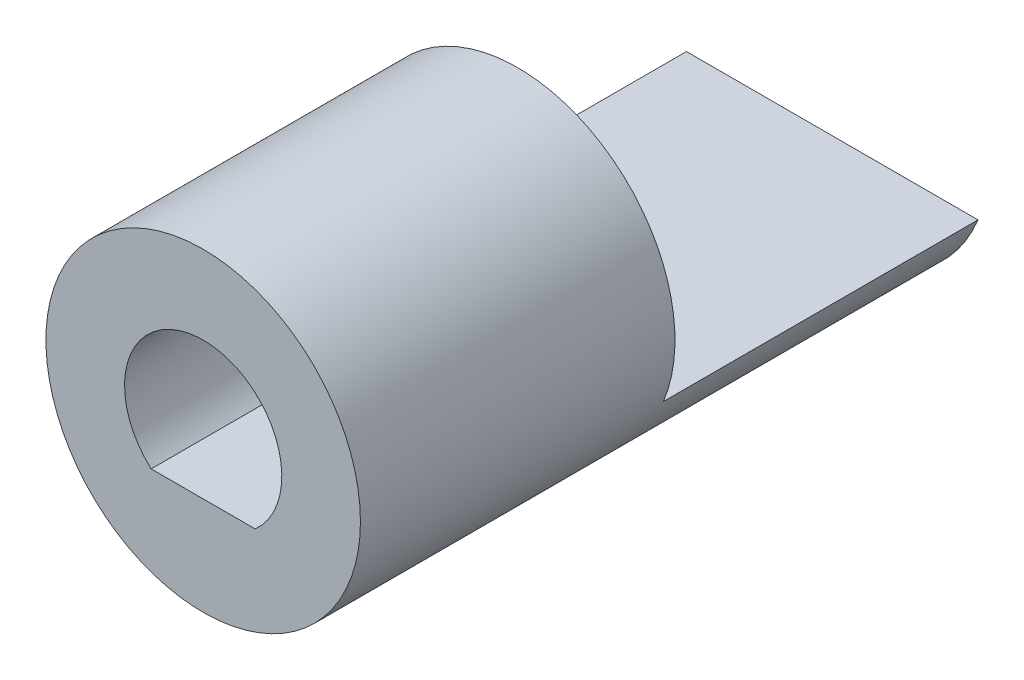
ISO-10303-21;
HEADER;
FILE_DESCRIPTION(('STEP AP214'),'2;1');
FILE_NAME('part.step','',(''),(''),'','','');
FILE_SCHEMA(('AUTOMOTIVE_DESIGN { 1 0 10303 214 1 1 1 1 }'));
ENDSEC;
DATA;
#1=APPLICATION_CONTEXT('core data for automotive mechanical design processes');
#2=APPLICATION_PROTOCOL_DEFINITION('international standard','automotive_design',2000,#1);
#3=PRODUCT_CONTEXT('',#1,'mechanical');
#4=PRODUCT('Part','Part','',(#3));
#5=PRODUCT_RELATED_PRODUCT_CATEGORY('part','',(#4));
#6=PRODUCT_DEFINITION_FORMATION('','',#4);
#7=PRODUCT_DEFINITION_CONTEXT('part definition',#1,'design');
#8=PRODUCT_DEFINITION('design','',#6,#7);
#9=PRODUCT_DEFINITION_SHAPE('','',#8);
#10=(LENGTH_UNIT() NAMED_UNIT(*) SI_UNIT(.MILLI.,.METRE.));
#11=(NAMED_UNIT(*) PLANE_ANGLE_UNIT() SI_UNIT($,.RADIAN.));
#12=(NAMED_UNIT(*) SI_UNIT($,.STERADIAN.) SOLID_ANGLE_UNIT());
#13=UNCERTAINTY_MEASURE_WITH_UNIT(LENGTH_MEASURE(1.E-05),#10,'distance_accuracy_value','');
#14=(GEOMETRIC_REPRESENTATION_CONTEXT(3) GLOBAL_UNCERTAINTY_ASSIGNED_CONTEXT((#13)) GLOBAL_UNIT_ASSIGNED_CONTEXT((#10,
#11,#12)) REPRESENTATION_CONTEXT('',''));
#15=CARTESIAN_POINT('',(0.,0.,0.));
#16=DIRECTION('',(0.,0.,1.));
#17=DIRECTION('',(1.,0.,0.));
#18=AXIS2_PLACEMENT_3D('',#15,#16,#17);
#19=CARTESIAN_POINT('',(0.,0.,0.));
#20=DIRECTION('',(0.,0.,1.));
#21=DIRECTION('',(1.,0.,0.));
#22=AXIS2_PLACEMENT_3D('',#19,#20,#21);
#23=PLANE('',#22);
#24=DIRECTION('',(1.,0.,0.));
#25=VECTOR('',#24,1.);
#26=CARTESIAN_POINT('',(0.,-4.7625,0.));
#27=LINE('',#26,#25);
#28=CARTESIAN_POINT('',(-11.7732150982644,-4.7625,0.));
#29=VERTEX_POINT('',#28);
#30=CARTESIAN_POINT('',(-4.20013020631504,-4.7625,0.));
#31=VERTEX_POINT('',#30);
#32=EDGE_CURVE('E50',#29,#31,#27,.T.);
#33=ORIENTED_EDGE('',*,*,#32,.F.);
#34=CARTESIAN_POINT('',(0.,0.,0.));
#35=DIRECTION('',(0.,0.,1.));
#36=DIRECTION('',(1.,0.,0.));
#37=AXIS2_PLACEMENT_3D('',#34,#35,#36);
#38=CIRCLE('',#37,12.7);
#39=CARTESIAN_POINT('',(11.7732150982644,-4.7625,0.));
#40=VERTEX_POINT('',#39);
#41=EDGE_CURVE('E78',#40,#29,#38,.T.);
#42=ORIENTED_EDGE('',*,*,#41,.F.);
#43=CARTESIAN_POINT('',(4.20013020631504,-4.7625,0.));
#44=VERTEX_POINT('',#43);
#45=EDGE_CURVE('E11',#44,#40,#27,.T.);
#46=ORIENTED_EDGE('',*,*,#45,.F.);
#47=CARTESIAN_POINT('',(0.,0.,0.));
#48=DIRECTION('',(0.,0.,1.));
#49=DIRECTION('',(1.,0.,0.));
#50=AXIS2_PLACEMENT_3D('',#47,#48,#49);
#51=CIRCLE('',#50,6.35);
#52=EDGE_CURVE('E76',#44,#31,#51,.T.);
#53=ORIENTED_EDGE('',*,*,#52,.T.);
#54=EDGE_LOOP('',(#33,#42,#46,#53));
#55=FACE_BOUND('',#54,.T.);
#56=ADVANCED_FACE('F39',(#55),#23,.F.);
#57=CARTESIAN_POINT('',(0.,-4.7625,25.4));
#58=DIRECTION('',(0.,1.,0.));
#59=DIRECTION('',(0.,0.,1.));
#60=AXIS2_PLACEMENT_3D('',#57,#58,#59);
#61=PLANE('',#60);
#62=DIRECTION('',(0.,0.,-1.));
#63=VECTOR('',#62,1.);
#64=CARTESIAN_POINT('',(4.20013020631504,-4.7625,25.4));
#65=LINE('',#64,#63);
#66=CARTESIAN_POINT('',(4.20013020631504,-4.7625,25.4));
#67=VERTEX_POINT('',#66);
#68=EDGE_CURVE('E65',#67,#44,#65,.T.);
#69=ORIENTED_EDGE('',*,*,#68,.T.);
#70=ORIENTED_EDGE('',*,*,#45,.T.);
#71=DIRECTION('',(0.,0.,1.));
#72=VECTOR('',#71,1.);
#73=CARTESIAN_POINT('',(11.7732150982644,-4.7625,-25.4));
#74=LINE('',#73,#72);
#75=CARTESIAN_POINT('',(11.7732150982644,-4.7625,-25.4));
#76=VERTEX_POINT('',#75);
#77=EDGE_CURVE('E89',#76,#40,#74,.T.);
#78=ORIENTED_EDGE('',*,*,#77,.F.);
#79=DIRECTION('',(1.,0.,0.));
#80=VECTOR('',#79,1.);
#81=CARTESIAN_POINT('',(0.,-4.7625,-25.4));
#82=LINE('',#81,#80);
#83=CARTESIAN_POINT('',(-11.7732150982644,-4.7625,-25.4));
#84=VERTEX_POINT('',#83);
#85=EDGE_CURVE('E110',#84,#76,#82,.T.);
#86=ORIENTED_EDGE('',*,*,#85,.F.);
#87=DIRECTION('',(0.,0.,1.));
#88=VECTOR('',#87,1.);
#89=CARTESIAN_POINT('',(-11.7732150982644,-4.7625,-25.4));
#90=LINE('',#89,#88);
#91=EDGE_CURVE('E94',#84,#29,#90,.T.);
#92=ORIENTED_EDGE('',*,*,#91,.T.);
#93=ORIENTED_EDGE('',*,*,#32,.T.);
#94=DIRECTION('',(0.,0.,-1.));
#95=VECTOR('',#94,1.);
#96=CARTESIAN_POINT('',(-4.20013020631504,-4.7625,25.4));
#97=LINE('',#96,#95);
#98=CARTESIAN_POINT('',(-4.20013020631504,-4.7625,25.4));
#99=VERTEX_POINT('',#98);
#100=EDGE_CURVE('E43',#99,#31,#97,.T.);
#101=ORIENTED_EDGE('',*,*,#100,.F.);
#102=DIRECTION('',(1.,0.,0.));
#103=VECTOR('',#102,1.);
#104=CARTESIAN_POINT('',(0.,-4.7625,25.4));
#105=LINE('',#104,#103);
#106=EDGE_CURVE('E83',#99,#67,#105,.T.);
#107=ORIENTED_EDGE('',*,*,#106,.T.);
#108=EDGE_LOOP('',(#69,#70,#78,#86,#92,#93,#101,#107));
#109=FACE_BOUND('',#108,.T.);
#110=ADVANCED_FACE('F41',(#109),#61,.T.);
#111=CARTESIAN_POINT('',(0.,0.,25.4));
#112=DIRECTION('',(0.,0.,-1.));
#113=DIRECTION('',(-1.,0.,0.));
#114=AXIS2_PLACEMENT_3D('',#111,#112,#113);
#115=CYLINDRICAL_SURFACE('',#114,6.35);
#116=ORIENTED_EDGE('',*,*,#52,.F.);
#117=ORIENTED_EDGE('',*,*,#68,.F.);
#118=CARTESIAN_POINT('',(0.,0.,25.4));
#119=DIRECTION('',(0.,0.,1.));
#120=DIRECTION('',(1.,0.,0.));
#121=AXIS2_PLACEMENT_3D('',#118,#119,#120);
#122=CIRCLE('',#121,6.35);
#123=EDGE_CURVE('E100',#67,#99,#122,.T.);
#124=ORIENTED_EDGE('',*,*,#123,.T.);
#125=ORIENTED_EDGE('',*,*,#100,.T.);
#126=EDGE_LOOP('',(#116,#117,#124,#125));
#127=FACE_BOUND('',#126,.T.);
#128=ADVANCED_FACE('F87',(#127),#115,.F.);
#129=CARTESIAN_POINT('',(0.,0.,25.4));
#130=DIRECTION('',(0.,0.,-1.));
#131=DIRECTION('',(-1.,0.,0.));
#132=AXIS2_PLACEMENT_3D('',#129,#130,#131);
#133=CYLINDRICAL_SURFACE('',#132,12.7);
#134=CARTESIAN_POINT('',(0.,0.,25.4));
#135=DIRECTION('',(0.,0.,1.));
#136=DIRECTION('',(1.,0.,0.));
#137=AXIS2_PLACEMENT_3D('',#134,#135,#136);
#138=CIRCLE('',#137,12.7);
#139=CARTESIAN_POINT('',(12.7,0.,25.4));
#140=VERTEX_POINT('',#139);
#141=EDGE_CURVE('E86',#140,#140,#138,.T.);
#142=ORIENTED_EDGE('',*,*,#141,.F.);
#143=EDGE_LOOP('',(#142));
#144=FACE_BOUND('',#143,.T.);
#145=ORIENTED_EDGE('',*,*,#41,.T.);
#146=ORIENTED_EDGE('',*,*,#91,.F.);
#147=CARTESIAN_POINT('',(0.,0.,-25.4));
#148=DIRECTION('',(0.,0.,1.));
#149=DIRECTION('',(1.,0.,0.));
#150=AXIS2_PLACEMENT_3D('',#147,#148,#149);
#151=CIRCLE('',#150,12.7);
#152=EDGE_CURVE('E107',#84,#76,#151,.T.);
#153=ORIENTED_EDGE('',*,*,#152,.T.);
#154=ORIENTED_EDGE('',*,*,#77,.T.);
#155=EDGE_LOOP('',(#145,#146,#153,#154));
#156=FACE_BOUND('',#155,.T.);
#157=ADVANCED_FACE('F124',(#144,#156),#133,.T.);
#158=CARTESIAN_POINT('',(0.,0.,25.4));
#159=DIRECTION('',(0.,0.,1.));
#160=DIRECTION('',(1.,0.,0.));
#161=AXIS2_PLACEMENT_3D('',#158,#159,#160);
#162=PLANE('',#161);
#163=ORIENTED_EDGE('',*,*,#106,.F.);
#164=ORIENTED_EDGE('',*,*,#123,.F.);
#165=EDGE_LOOP('',(#163,#164));
#166=FACE_BOUND('',#165,.T.);
#167=ORIENTED_EDGE('',*,*,#141,.T.);
#168=EDGE_LOOP('',(#167));
#169=FACE_BOUND('',#168,.T.);
#170=ADVANCED_FACE('F128',(#166,#169),#162,.T.);
#171=CARTESIAN_POINT('',(0.,0.,-25.4));
#172=DIRECTION('',(0.,0.,1.));
#173=DIRECTION('',(1.,0.,0.));
#174=AXIS2_PLACEMENT_3D('',#171,#172,#173);
#175=PLANE('',#174);
#176=ORIENTED_EDGE('',*,*,#85,.T.);
#177=ORIENTED_EDGE('',*,*,#152,.F.);
#178=EDGE_LOOP('',(#176,#177));
#179=FACE_BOUND('',#178,.T.);
#180=ADVANCED_FACE('F119',(#179),#175,.F.);
#181=CLOSED_SHELL('',(#56,#110,#128,#157,#170,#180));
#182=MANIFOLD_SOLID_BREP('B2',#181);
#183=ADVANCED_BREP_SHAPE_REPRESENTATION('',(#18,#182),#14);
#184=SHAPE_DEFINITION_REPRESENTATION(#9,#183);
ENDSEC;
END-ISO-10303-21;
